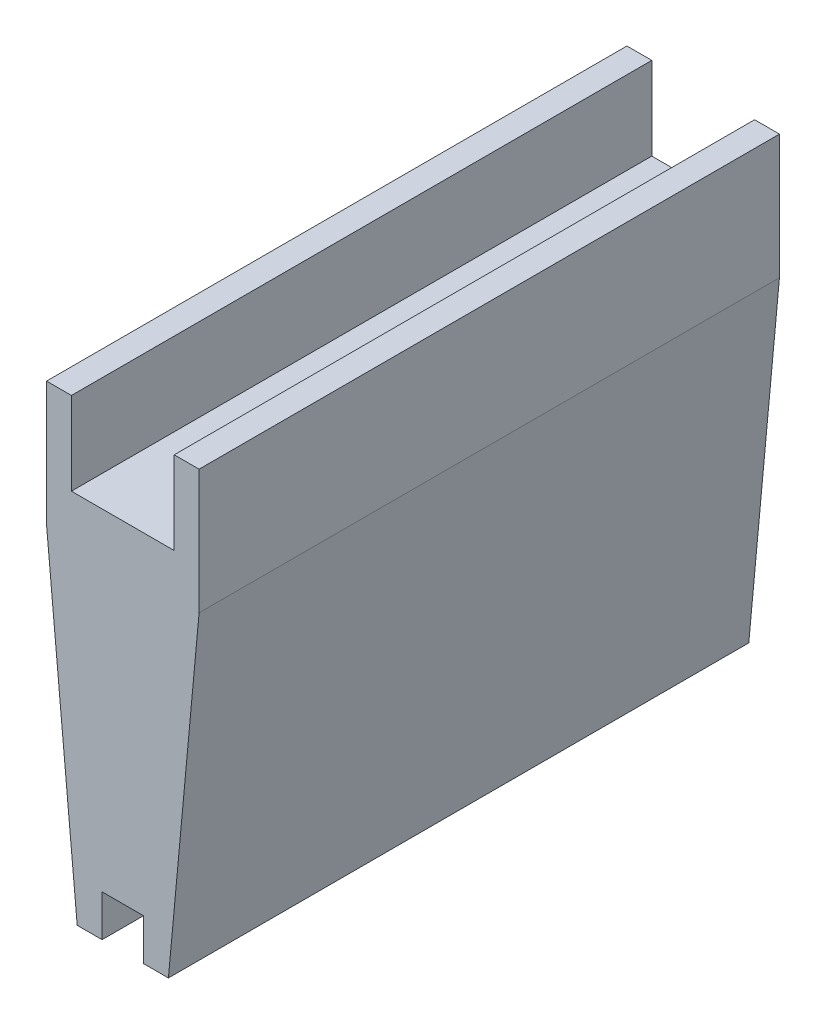
ISO-10303-21;
HEADER;
FILE_DESCRIPTION(('STEP AP214'),'2;1');
FILE_NAME('part.step','',(''),(''),'','','');
FILE_SCHEMA(('AUTOMOTIVE_DESIGN { 1 0 10303 214 1 1 1 1 }'));
ENDSEC;
DATA;
#1=APPLICATION_CONTEXT('core data for automotive mechanical design processes');
#2=APPLICATION_PROTOCOL_DEFINITION('international standard','automotive_design',2000,#1);
#3=PRODUCT_CONTEXT('',#1,'mechanical');
#4=PRODUCT('Part','Part','',(#3));
#5=PRODUCT_RELATED_PRODUCT_CATEGORY('part','',(#4));
#6=PRODUCT_DEFINITION_FORMATION('','',#4);
#7=PRODUCT_DEFINITION_CONTEXT('part definition',#1,'design');
#8=PRODUCT_DEFINITION('design','',#6,#7);
#9=PRODUCT_DEFINITION_SHAPE('','',#8);
#10=(LENGTH_UNIT() NAMED_UNIT(*) SI_UNIT(.MILLI.,.METRE.));
#11=(NAMED_UNIT(*) PLANE_ANGLE_UNIT() SI_UNIT($,.RADIAN.));
#12=(NAMED_UNIT(*) SI_UNIT($,.STERADIAN.) SOLID_ANGLE_UNIT());
#13=UNCERTAINTY_MEASURE_WITH_UNIT(LENGTH_MEASURE(1.E-05),#10,'distance_accuracy_value','');
#14=(GEOMETRIC_REPRESENTATION_CONTEXT(3) GLOBAL_UNCERTAINTY_ASSIGNED_CONTEXT((#13)) GLOBAL_UNIT_ASSIGNED_CONTEXT((#10,
#11,#12)) REPRESENTATION_CONTEXT('',''));
#15=CARTESIAN_POINT('',(0.,0.,0.));
#16=DIRECTION('',(0.,0.,1.));
#17=DIRECTION('',(1.,0.,0.));
#18=AXIS2_PLACEMENT_3D('',#15,#16,#17);
#19=CARTESIAN_POINT('',(0.,0.,70.));
#20=DIRECTION('',(0.,1.,0.));
#21=DIRECTION('',(0.,0.,1.));
#22=AXIS2_PLACEMENT_3D('',#19,#20,#21);
#23=PLANE('',#22);
#24=DIRECTION('',(1.,0.,0.));
#25=VECTOR('',#24,1.);
#26=CARTESIAN_POINT('',(0.,0.,70.));
#27=LINE('',#26,#25);
#28=CARTESIAN_POINT('',(3.7,0.,70.));
#29=VERTEX_POINT('',#28);
#30=CARTESIAN_POINT('',(6.7,0.,70.));
#31=VERTEX_POINT('',#30);
#32=EDGE_CURVE('E140',#29,#31,#27,.T.);
#33=ORIENTED_EDGE('',*,*,#32,.F.);
#34=DIRECTION('',(0.,0.,-1.));
#35=VECTOR('',#34,1.);
#36=CARTESIAN_POINT('',(3.7,0.,70.));
#37=LINE('',#36,#35);
#38=CARTESIAN_POINT('',(3.7,0.,0.));
#39=VERTEX_POINT('',#38);
#40=EDGE_CURVE('E166',#29,#39,#37,.T.);
#41=ORIENTED_EDGE('',*,*,#40,.T.);
#42=DIRECTION('',(1.,0.,0.));
#43=VECTOR('',#42,1.);
#44=CARTESIAN_POINT('',(0.,0.,0.));
#45=LINE('',#44,#43);
#46=CARTESIAN_POINT('',(6.7,0.,0.));
#47=VERTEX_POINT('',#46);
#48=EDGE_CURVE('E164',#39,#47,#45,.T.);
#49=ORIENTED_EDGE('',*,*,#48,.T.);
#50=DIRECTION('',(0.,0.,-1.));
#51=VECTOR('',#50,1.);
#52=CARTESIAN_POINT('',(6.7,0.,70.));
#53=LINE('',#52,#51);
#54=EDGE_CURVE('E157',#31,#47,#53,.T.);
#55=ORIENTED_EDGE('',*,*,#54,.F.);
#56=EDGE_LOOP('',(#33,#41,#49,#55));
#57=FACE_BOUND('',#56,.T.);
#58=ADVANCED_FACE('F39',(#57),#23,.F.);
#59=CARTESIAN_POINT('',(6.7,5.,70.));
#60=DIRECTION('',(-1.,0.,0.));
#61=DIRECTION('',(0.,0.,1.));
#62=AXIS2_PLACEMENT_3D('',#59,#60,#61);
#63=PLANE('',#62);
#64=DIRECTION('',(0.,1.,0.));
#65=VECTOR('',#64,1.);
#66=CARTESIAN_POINT('',(6.7,5.,0.));
#67=LINE('',#66,#65);
#68=CARTESIAN_POINT('',(6.7,5.,0.));
#69=VERTEX_POINT('',#68);
#70=EDGE_CURVE('E243',#47,#69,#67,.T.);
#71=ORIENTED_EDGE('',*,*,#70,.T.);
#72=DIRECTION('',(0.,0.,-1.));
#73=VECTOR('',#72,1.);
#74=CARTESIAN_POINT('',(6.7,5.,70.));
#75=LINE('',#74,#73);
#76=CARTESIAN_POINT('',(6.7,5.,70.));
#77=VERTEX_POINT('',#76);
#78=EDGE_CURVE('E159',#77,#69,#75,.T.);
#79=ORIENTED_EDGE('',*,*,#78,.F.);
#80=DIRECTION('',(0.,1.,0.));
#81=VECTOR('',#80,1.);
#82=CARTESIAN_POINT('',(6.7,5.,70.));
#83=LINE('',#82,#81);
#84=EDGE_CURVE('E143',#31,#77,#83,.T.);
#85=ORIENTED_EDGE('',*,*,#84,.F.);
#86=ORIENTED_EDGE('',*,*,#54,.T.);
#87=EDGE_LOOP('',(#71,#79,#85,#86));
#88=FACE_BOUND('',#87,.T.);
#89=ADVANCED_FACE('F156',(#88),#63,.F.);
#90=CARTESIAN_POINT('',(11.7,5.,70.));
#91=DIRECTION('',(0.,1.,0.));
#92=DIRECTION('',(-1.,0.,0.));
#93=AXIS2_PLACEMENT_3D('',#90,#91,#92);
#94=PLANE('',#93);
#95=DIRECTION('',(1.,0.,0.));
#96=VECTOR('',#95,1.);
#97=CARTESIAN_POINT('',(11.7,5.,0.));
#98=LINE('',#97,#96);
#99=CARTESIAN_POINT('',(11.7,5.,0.));
#100=VERTEX_POINT('',#99);
#101=EDGE_CURVE('E242',#69,#100,#98,.T.);
#102=ORIENTED_EDGE('',*,*,#101,.T.);
#103=DIRECTION('',(0.,0.,-1.));
#104=VECTOR('',#103,1.);
#105=CARTESIAN_POINT('',(11.7,5.,70.));
#106=LINE('',#105,#104);
#107=CARTESIAN_POINT('',(11.7,5.,70.));
#108=VERTEX_POINT('',#107);
#109=EDGE_CURVE('E170',#108,#100,#106,.T.);
#110=ORIENTED_EDGE('',*,*,#109,.F.);
#111=DIRECTION('',(1.,0.,0.));
#112=VECTOR('',#111,1.);
#113=CARTESIAN_POINT('',(11.7,5.,70.));
#114=LINE('',#113,#112);
#115=EDGE_CURVE('E161',#77,#108,#114,.T.);
#116=ORIENTED_EDGE('',*,*,#115,.F.);
#117=ORIENTED_EDGE('',*,*,#78,.T.);
#118=EDGE_LOOP('',(#102,#110,#116,#117));
#119=FACE_BOUND('',#118,.T.);
#120=ADVANCED_FACE('F263',(#119),#94,.F.);
#121=CARTESIAN_POINT('',(11.7,0.,70.));
#122=DIRECTION('',(1.,0.,0.));
#123=DIRECTION('',(0.,0.,-1.));
#124=AXIS2_PLACEMENT_3D('',#121,#122,#123);
#125=PLANE('',#124);
#126=DIRECTION('',(0.,-1.,0.));
#127=VECTOR('',#126,1.);
#128=CARTESIAN_POINT('',(11.7,0.,0.));
#129=LINE('',#128,#127);
#130=CARTESIAN_POINT('',(11.7,0.,0.));
#131=VERTEX_POINT('',#130);
#132=EDGE_CURVE('E199',#100,#131,#129,.T.);
#133=ORIENTED_EDGE('',*,*,#132,.T.);
#134=DIRECTION('',(0.,0.,-1.));
#135=VECTOR('',#134,1.);
#136=CARTESIAN_POINT('',(11.7,0.,70.));
#137=LINE('',#136,#135);
#138=CARTESIAN_POINT('',(11.7,0.,70.));
#139=VERTEX_POINT('',#138);
#140=EDGE_CURVE('E230',#139,#131,#137,.T.);
#141=ORIENTED_EDGE('',*,*,#140,.F.);
#142=DIRECTION('',(0.,-1.,0.));
#143=VECTOR('',#142,1.);
#144=CARTESIAN_POINT('',(11.7,0.,70.));
#145=LINE('',#144,#143);
#146=EDGE_CURVE('E239',#108,#139,#145,.T.);
#147=ORIENTED_EDGE('',*,*,#146,.F.);
#148=ORIENTED_EDGE('',*,*,#109,.T.);
#149=EDGE_LOOP('',(#133,#141,#147,#148));
#150=FACE_BOUND('',#149,.T.);
#151=ADVANCED_FACE('F237',(#150),#125,.F.);
#152=CARTESIAN_POINT('',(18.4,0.,70.));
#153=DIRECTION('',(0.,1.,0.));
#154=DIRECTION('',(0.,0.,1.));
#155=AXIS2_PLACEMENT_3D('',#152,#153,#154);
#156=PLANE('',#155);
#157=DIRECTION('',(1.,0.,0.));
#158=VECTOR('',#157,1.);
#159=CARTESIAN_POINT('',(18.4,0.,0.));
#160=LINE('',#159,#158);
#161=CARTESIAN_POINT('',(14.7,0.,0.));
#162=VERTEX_POINT('',#161);
#163=EDGE_CURVE('E195',#131,#162,#160,.T.);
#164=ORIENTED_EDGE('',*,*,#163,.T.);
#165=DIRECTION('',(0.,0.,1.));
#166=VECTOR('',#165,1.);
#167=CARTESIAN_POINT('',(14.7,0.,70.));
#168=LINE('',#167,#166);
#169=CARTESIAN_POINT('',(14.7,0.,70.));
#170=VERTEX_POINT('',#169);
#171=EDGE_CURVE('E48',#162,#170,#168,.T.);
#172=ORIENTED_EDGE('',*,*,#171,.T.);
#173=DIRECTION('',(1.,0.,0.));
#174=VECTOR('',#173,1.);
#175=CARTESIAN_POINT('',(18.4,0.,70.));
#176=LINE('',#175,#174);
#177=EDGE_CURVE('E260',#139,#170,#176,.T.);
#178=ORIENTED_EDGE('',*,*,#177,.F.);
#179=ORIENTED_EDGE('',*,*,#140,.T.);
#180=EDGE_LOOP('',(#164,#172,#178,#179));
#181=FACE_BOUND('',#180,.T.);
#182=ADVANCED_FACE('F270',(#181),#156,.F.);
#183=CARTESIAN_POINT('',(18.4,55.,70.));
#184=DIRECTION('',(-1.,0.,0.));
#185=DIRECTION('',(0.,0.,1.));
#186=AXIS2_PLACEMENT_3D('',#183,#184,#185);
#187=PLANE('',#186);
#188=DIRECTION('',(0.,1.,0.));
#189=VECTOR('',#188,1.);
#190=CARTESIAN_POINT('',(18.4,55.,70.));
#191=LINE('',#190,#189);
#192=CARTESIAN_POINT('',(18.4,40.0000000000015,70.));
#193=VERTEX_POINT('',#192);
#194=CARTESIAN_POINT('',(18.4,55.,70.));
#195=VERTEX_POINT('',#194);
#196=EDGE_CURVE('E188',#193,#195,#191,.T.);
#197=ORIENTED_EDGE('',*,*,#196,.F.);
#198=DIRECTION('',(0.,0.,-1.));
#199=VECTOR('',#198,1.);
#200=CARTESIAN_POINT('',(18.4,40.0000000000015,70.));
#201=LINE('',#200,#199);
#202=CARTESIAN_POINT('',(18.4,40.0000000000015,0.));
#203=VERTEX_POINT('',#202);
#204=EDGE_CURVE('E178',#193,#203,#201,.T.);
#205=ORIENTED_EDGE('',*,*,#204,.T.);
#206=DIRECTION('',(0.,1.,0.));
#207=VECTOR('',#206,1.);
#208=CARTESIAN_POINT('',(18.4,55.,0.));
#209=LINE('',#208,#207);
#210=CARTESIAN_POINT('',(18.4,55.,0.));
#211=VERTEX_POINT('',#210);
#212=EDGE_CURVE('E186',#203,#211,#209,.T.);
#213=ORIENTED_EDGE('',*,*,#212,.T.);
#214=DIRECTION('',(0.,0.,-1.));
#215=VECTOR('',#214,1.);
#216=CARTESIAN_POINT('',(18.4,55.,70.));
#217=LINE('',#216,#215);
#218=EDGE_CURVE('E228',#195,#211,#217,.T.);
#219=ORIENTED_EDGE('',*,*,#218,.F.);
#220=EDGE_LOOP('',(#197,#205,#213,#219));
#221=FACE_BOUND('',#220,.T.);
#222=ADVANCED_FACE('F184',(#221),#187,.F.);
#223=CARTESIAN_POINT('',(15.4,55.,70.));
#224=DIRECTION('',(0.,-1.,0.));
#225=DIRECTION('',(0.,0.,-1.));
#226=AXIS2_PLACEMENT_3D('',#223,#224,#225);
#227=PLANE('',#226);
#228=DIRECTION('',(-1.,0.,0.));
#229=VECTOR('',#228,1.);
#230=CARTESIAN_POINT('',(15.4,55.,0.));
#231=LINE('',#230,#229);
#232=CARTESIAN_POINT('',(15.4,55.,0.));
#233=VERTEX_POINT('',#232);
#234=EDGE_CURVE('E194',#211,#233,#231,.T.);
#235=ORIENTED_EDGE('',*,*,#234,.T.);
#236=DIRECTION('',(0.,0.,-1.));
#237=VECTOR('',#236,1.);
#238=CARTESIAN_POINT('',(15.4,55.,70.));
#239=LINE('',#238,#237);
#240=CARTESIAN_POINT('',(15.4,55.,70.));
#241=VERTEX_POINT('',#240);
#242=EDGE_CURVE('E225',#241,#233,#239,.T.);
#243=ORIENTED_EDGE('',*,*,#242,.F.);
#244=DIRECTION('',(-1.,0.,0.));
#245=VECTOR('',#244,1.);
#246=CARTESIAN_POINT('',(15.4,55.,70.));
#247=LINE('',#246,#245);
#248=EDGE_CURVE('E257',#195,#241,#247,.T.);
#249=ORIENTED_EDGE('',*,*,#248,.F.);
#250=ORIENTED_EDGE('',*,*,#218,.T.);
#251=EDGE_LOOP('',(#235,#243,#249,#250));
#252=FACE_BOUND('',#251,.T.);
#253=ADVANCED_FACE('F315',(#252),#227,.F.);
#254=CARTESIAN_POINT('',(15.4,45.,70.));
#255=DIRECTION('',(1.,0.,0.));
#256=DIRECTION('',(0.,1.,0.));
#257=AXIS2_PLACEMENT_3D('',#254,#255,#256);
#258=PLANE('',#257);
#259=DIRECTION('',(0.,-1.,0.));
#260=VECTOR('',#259,1.);
#261=CARTESIAN_POINT('',(15.4,45.,0.));
#262=LINE('',#261,#260);
#263=CARTESIAN_POINT('',(15.4,45.,0.));
#264=VERTEX_POINT('',#263);
#265=EDGE_CURVE('E197',#233,#264,#262,.T.);
#266=ORIENTED_EDGE('',*,*,#265,.T.);
#267=DIRECTION('',(0.,0.,-1.));
#268=VECTOR('',#267,1.);
#269=CARTESIAN_POINT('',(15.4,45.,70.));
#270=LINE('',#269,#268);
#271=CARTESIAN_POINT('',(15.4,45.,70.));
#272=VERTEX_POINT('',#271);
#273=EDGE_CURVE('E222',#272,#264,#270,.T.);
#274=ORIENTED_EDGE('',*,*,#273,.F.);
#275=DIRECTION('',(0.,-1.,0.));
#276=VECTOR('',#275,1.);
#277=CARTESIAN_POINT('',(15.4,45.,70.));
#278=LINE('',#277,#276);
#279=EDGE_CURVE('E255',#241,#272,#278,.T.);
#280=ORIENTED_EDGE('',*,*,#279,.F.);
#281=ORIENTED_EDGE('',*,*,#242,.T.);
#282=EDGE_LOOP('',(#266,#274,#280,#281));
#283=FACE_BOUND('',#282,.T.);
#284=ADVANCED_FACE('F311',(#283),#258,.F.);
#285=CARTESIAN_POINT('',(3.,45.,70.));
#286=DIRECTION('',(0.,-1.,0.));
#287=DIRECTION('',(0.,0.,-1.));
#288=AXIS2_PLACEMENT_3D('',#285,#286,#287);
#289=PLANE('',#288);
#290=DIRECTION('',(-1.,0.,0.));
#291=VECTOR('',#290,1.);
#292=CARTESIAN_POINT('',(3.,45.,0.));
#293=LINE('',#292,#291);
#294=CARTESIAN_POINT('',(3.,45.,0.));
#295=VERTEX_POINT('',#294);
#296=EDGE_CURVE('E204',#264,#295,#293,.T.);
#297=ORIENTED_EDGE('',*,*,#296,.T.);
#298=DIRECTION('',(0.,0.,-1.));
#299=VECTOR('',#298,1.);
#300=CARTESIAN_POINT('',(3.,45.,70.));
#301=LINE('',#300,#299);
#302=CARTESIAN_POINT('',(3.,45.,70.));
#303=VERTEX_POINT('',#302);
#304=EDGE_CURVE('E219',#303,#295,#301,.T.);
#305=ORIENTED_EDGE('',*,*,#304,.F.);
#306=DIRECTION('',(-1.,0.,0.));
#307=VECTOR('',#306,1.);
#308=CARTESIAN_POINT('',(3.,45.,70.));
#309=LINE('',#308,#307);
#310=EDGE_CURVE('E253',#272,#303,#309,.T.);
#311=ORIENTED_EDGE('',*,*,#310,.F.);
#312=ORIENTED_EDGE('',*,*,#273,.T.);
#313=EDGE_LOOP('',(#297,#305,#311,#312));
#314=FACE_BOUND('',#313,.T.);
#315=ADVANCED_FACE('F307',(#314),#289,.F.);
#316=CARTESIAN_POINT('',(3.,55.,70.));
#317=DIRECTION('',(-1.,0.,0.));
#318=DIRECTION('',(0.,0.,1.));
#319=AXIS2_PLACEMENT_3D('',#316,#317,#318);
#320=PLANE('',#319);
#321=DIRECTION('',(0.,1.,0.));
#322=VECTOR('',#321,1.);
#323=CARTESIAN_POINT('',(3.,55.,0.));
#324=LINE('',#323,#322);
#325=CARTESIAN_POINT('',(3.,55.,0.));
#326=VERTEX_POINT('',#325);
#327=EDGE_CURVE('E206',#295,#326,#324,.T.);
#328=ORIENTED_EDGE('',*,*,#327,.T.);
#329=DIRECTION('',(0.,0.,-1.));
#330=VECTOR('',#329,1.);
#331=CARTESIAN_POINT('',(3.,55.,70.));
#332=LINE('',#331,#330);
#333=CARTESIAN_POINT('',(3.,55.,70.));
#334=VERTEX_POINT('',#333);
#335=EDGE_CURVE('E215',#334,#326,#332,.T.);
#336=ORIENTED_EDGE('',*,*,#335,.F.);
#337=DIRECTION('',(0.,1.,0.));
#338=VECTOR('',#337,1.);
#339=CARTESIAN_POINT('',(3.,55.,70.));
#340=LINE('',#339,#338);
#341=EDGE_CURVE('E251',#303,#334,#340,.T.);
#342=ORIENTED_EDGE('',*,*,#341,.F.);
#343=ORIENTED_EDGE('',*,*,#304,.T.);
#344=EDGE_LOOP('',(#328,#336,#342,#343));
#345=FACE_BOUND('',#344,.T.);
#346=ADVANCED_FACE('F302',(#345),#320,.F.);
#347=CARTESIAN_POINT('',(0.,55.,70.));
#348=DIRECTION('',(0.,-1.,0.));
#349=DIRECTION('',(0.,0.,-1.));
#350=AXIS2_PLACEMENT_3D('',#347,#348,#349);
#351=PLANE('',#350);
#352=DIRECTION('',(-1.,0.,0.));
#353=VECTOR('',#352,1.);
#354=CARTESIAN_POINT('',(0.,55.,0.));
#355=LINE('',#354,#353);
#356=CARTESIAN_POINT('',(0.,55.,0.));
#357=VERTEX_POINT('',#356);
#358=EDGE_CURVE('E208',#326,#357,#355,.T.);
#359=ORIENTED_EDGE('',*,*,#358,.T.);
#360=DIRECTION('',(0.,0.,-1.));
#361=VECTOR('',#360,1.);
#362=CARTESIAN_POINT('',(0.,55.,70.));
#363=LINE('',#362,#361);
#364=CARTESIAN_POINT('',(0.,55.,70.));
#365=VERTEX_POINT('',#364);
#366=EDGE_CURVE('E212',#365,#357,#363,.T.);
#367=ORIENTED_EDGE('',*,*,#366,.F.);
#368=DIRECTION('',(-1.,0.,0.));
#369=VECTOR('',#368,1.);
#370=CARTESIAN_POINT('',(0.,55.,70.));
#371=LINE('',#370,#369);
#372=EDGE_CURVE('E249',#334,#365,#371,.T.);
#373=ORIENTED_EDGE('',*,*,#372,.F.);
#374=ORIENTED_EDGE('',*,*,#335,.T.);
#375=EDGE_LOOP('',(#359,#367,#373,#374));
#376=FACE_BOUND('',#375,.T.);
#377=ADVANCED_FACE('F297',(#376),#351,.F.);
#378=CARTESIAN_POINT('',(0.,0.,70.));
#379=DIRECTION('',(1.,0.,0.));
#380=DIRECTION('',(0.,0.,-1.));
#381=AXIS2_PLACEMENT_3D('',#378,#379,#380);
#382=PLANE('',#381);
#383=DIRECTION('',(0.,-1.,0.));
#384=VECTOR('',#383,1.);
#385=CARTESIAN_POINT('',(0.,0.,0.));
#386=LINE('',#385,#384);
#387=CARTESIAN_POINT('',(0.,40.0000000000015,0.));
#388=VERTEX_POINT('',#387);
#389=EDGE_CURVE('E152',#357,#388,#386,.T.);
#390=ORIENTED_EDGE('',*,*,#389,.T.);
#391=DIRECTION('',(0.,0.,1.));
#392=VECTOR('',#391,1.);
#393=CARTESIAN_POINT('',(0.,40.0000000000015,70.));
#394=LINE('',#393,#392);
#395=CARTESIAN_POINT('',(0.,40.0000000000015,70.));
#396=VERTEX_POINT('',#395);
#397=EDGE_CURVE('E175',#388,#396,#394,.T.);
#398=ORIENTED_EDGE('',*,*,#397,.T.);
#399=DIRECTION('',(0.,-1.,0.));
#400=VECTOR('',#399,1.);
#401=CARTESIAN_POINT('',(0.,0.,70.));
#402=LINE('',#401,#400);
#403=EDGE_CURVE('E216',#365,#396,#402,.T.);
#404=ORIENTED_EDGE('',*,*,#403,.F.);
#405=ORIENTED_EDGE('',*,*,#366,.T.);
#406=EDGE_LOOP('',(#390,#398,#404,#405));
#407=FACE_BOUND('',#406,.T.);
#408=ADVANCED_FACE('F292',(#407),#382,.F.);
#409=CARTESIAN_POINT('',(0.,0.,70.));
#410=DIRECTION('',(0.,0.,-1.));
#411=DIRECTION('',(-1.,0.,0.));
#412=AXIS2_PLACEMENT_3D('',#409,#410,#411);
#413=PLANE('',#412);
#414=ORIENTED_EDGE('',*,*,#177,.T.);
#415=DIRECTION('',(-0.0921067949167532,-0.995749134235207,0.));
#416=VECTOR('',#415,1.);
#417=CARTESIAN_POINT('',(18.4,40.0000000000015,70.));
#418=LINE('',#417,#416);
#419=EDGE_CURVE('E11',#170,#193,#418,.F.);
#420=ORIENTED_EDGE('',*,*,#419,.T.);
#421=ORIENTED_EDGE('',*,*,#196,.T.);
#422=ORIENTED_EDGE('',*,*,#248,.T.);
#423=ORIENTED_EDGE('',*,*,#279,.T.);
#424=ORIENTED_EDGE('',*,*,#310,.T.);
#425=ORIENTED_EDGE('',*,*,#341,.T.);
#426=ORIENTED_EDGE('',*,*,#372,.T.);
#427=ORIENTED_EDGE('',*,*,#403,.T.);
#428=DIRECTION('',(-0.0921067949167532,0.995749134235207,0.));
#429=VECTOR('',#428,1.);
#430=CARTESIAN_POINT('',(3.7,0.,70.));
#431=LINE('',#430,#429);
#432=EDGE_CURVE('E147',#396,#29,#431,.F.);
#433=ORIENTED_EDGE('',*,*,#432,.T.);
#434=ORIENTED_EDGE('',*,*,#32,.T.);
#435=ORIENTED_EDGE('',*,*,#84,.T.);
#436=ORIENTED_EDGE('',*,*,#115,.T.);
#437=ORIENTED_EDGE('',*,*,#146,.T.);
#438=EDGE_LOOP('',(#414,#420,#421,#422,#423,#424,#425,#426,#427,#433,#434,#435,#436,#437));
#439=FACE_BOUND('',#438,.T.);
#440=ADVANCED_FACE('F142',(#439),#413,.F.);
#441=CARTESIAN_POINT('',(0.,0.,0.));
#442=DIRECTION('',(0.,0.,-1.));
#443=DIRECTION('',(-1.,0.,0.));
#444=AXIS2_PLACEMENT_3D('',#441,#442,#443);
#445=PLANE('',#444);
#446=ORIENTED_EDGE('',*,*,#212,.F.);
#447=DIRECTION('',(0.0921067949167532,0.995749134235207,0.));
#448=VECTOR('',#447,1.);
#449=CARTESIAN_POINT('',(14.5752901734534,-1.34821434104439,0.));
#450=LINE('',#449,#448);
#451=EDGE_CURVE('E62',#203,#162,#450,.F.);
#452=ORIENTED_EDGE('',*,*,#451,.T.);
#453=ORIENTED_EDGE('',*,*,#163,.F.);
#454=ORIENTED_EDGE('',*,*,#132,.F.);
#455=ORIENTED_EDGE('',*,*,#101,.F.);
#456=ORIENTED_EDGE('',*,*,#70,.F.);
#457=ORIENTED_EDGE('',*,*,#48,.F.);
#458=DIRECTION('',(0.0921067949167532,-0.995749134235207,0.));
#459=VECTOR('',#458,1.);
#460=CARTESIAN_POINT('',(3.66861045182161,0.339346466793486,0.));
#461=LINE('',#460,#459);
#462=EDGE_CURVE('E168',#39,#388,#461,.F.);
#463=ORIENTED_EDGE('',*,*,#462,.T.);
#464=ORIENTED_EDGE('',*,*,#389,.F.);
#465=ORIENTED_EDGE('',*,*,#358,.F.);
#466=ORIENTED_EDGE('',*,*,#327,.F.);
#467=ORIENTED_EDGE('',*,*,#296,.F.);
#468=ORIENTED_EDGE('',*,*,#265,.F.);
#469=ORIENTED_EDGE('',*,*,#234,.F.);
#470=EDGE_LOOP('',(#446,#452,#453,#454,#455,#456,#457,#463,#464,#465,#466,#467,#468,#469));
#471=FACE_BOUND('',#470,.T.);
#472=ADVANCED_FACE('F192',(#471),#445,.T.);
#473=CARTESIAN_POINT('',(3.7,0.,70.));
#474=DIRECTION('',(0.995749134235206,0.0921067949167532,0.));
#475=DIRECTION('',(0.,0.,-1.));
#476=AXIS2_PLACEMENT_3D('',#473,#474,#475);
#477=PLANE('',#476);
#478=ORIENTED_EDGE('',*,*,#432,.F.);
#479=ORIENTED_EDGE('',*,*,#397,.F.);
#480=ORIENTED_EDGE('',*,*,#462,.F.);
#481=ORIENTED_EDGE('',*,*,#40,.F.);
#482=EDGE_LOOP('',(#478,#479,#480,#481));
#483=FACE_BOUND('',#482,.T.);
#484=ADVANCED_FACE('F278',(#483),#477,.F.);
#485=CARTESIAN_POINT('',(18.4,40.0000000000015,70.));
#486=DIRECTION('',(-0.995749134235206,0.0921067949167531,0.));
#487=DIRECTION('',(0.,0.,-1.));
#488=AXIS2_PLACEMENT_3D('',#485,#486,#487);
#489=PLANE('',#488);
#490=ORIENTED_EDGE('',*,*,#419,.F.);
#491=ORIENTED_EDGE('',*,*,#171,.F.);
#492=ORIENTED_EDGE('',*,*,#451,.F.);
#493=ORIENTED_EDGE('',*,*,#204,.F.);
#494=EDGE_LOOP('',(#490,#491,#492,#493));
#495=FACE_BOUND('',#494,.T.);
#496=ADVANCED_FACE('F42',(#495),#489,.F.);
#497=CLOSED_SHELL('',(#58,#89,#120,#151,#182,#222,#253,#284,#315,#346,#377,#408,#440,#472,#484,#496));
#498=MANIFOLD_SOLID_BREP('B2',#497);
#499=ADVANCED_BREP_SHAPE_REPRESENTATION('',(#18,#498),#14);
#500=SHAPE_DEFINITION_REPRESENTATION(#9,#499);
ENDSEC;
END-ISO-10303-21;
